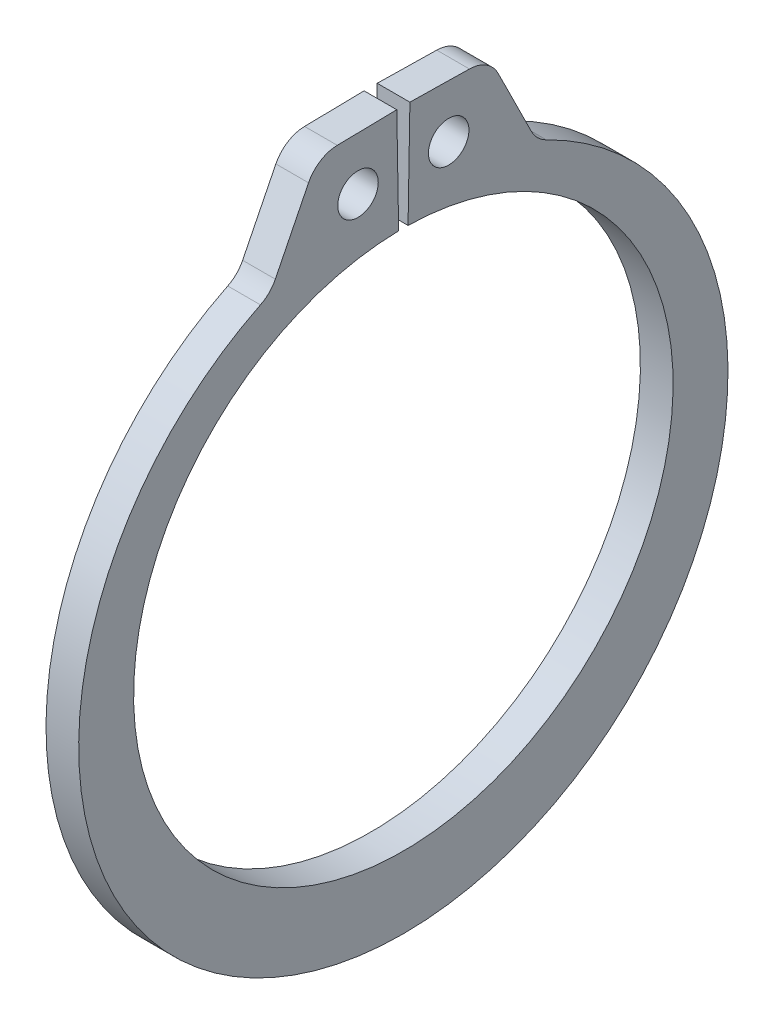
ISO-10303-21;
HEADER;
FILE_DESCRIPTION(('STEP AP214'),'2;1');
FILE_NAME('part.step','',(''),(''),'','','');
FILE_SCHEMA(('AUTOMOTIVE_DESIGN { 1 0 10303 214 1 1 1 1 }'));
ENDSEC;
DATA;
#1=APPLICATION_CONTEXT('core data for automotive mechanical design processes');
#2=APPLICATION_PROTOCOL_DEFINITION('international standard','automotive_design',2000,#1);
#3=PRODUCT_CONTEXT('',#1,'mechanical');
#4=PRODUCT('Part','Part','',(#3));
#5=PRODUCT_RELATED_PRODUCT_CATEGORY('part','',(#4));
#6=PRODUCT_DEFINITION_FORMATION('','',#4);
#7=PRODUCT_DEFINITION_CONTEXT('part definition',#1,'design');
#8=PRODUCT_DEFINITION('design','',#6,#7);
#9=PRODUCT_DEFINITION_SHAPE('','',#8);
#10=(LENGTH_UNIT() NAMED_UNIT(*) SI_UNIT(.MILLI.,.METRE.));
#11=(NAMED_UNIT(*) PLANE_ANGLE_UNIT() SI_UNIT($,.RADIAN.));
#12=(NAMED_UNIT(*) SI_UNIT($,.STERADIAN.) SOLID_ANGLE_UNIT());
#13=UNCERTAINTY_MEASURE_WITH_UNIT(LENGTH_MEASURE(1.E-05),#10,'distance_accuracy_value','');
#14=(GEOMETRIC_REPRESENTATION_CONTEXT(3) GLOBAL_UNCERTAINTY_ASSIGNED_CONTEXT((#13)) GLOBAL_UNIT_ASSIGNED_CONTEXT((#10,
#11,#12)) REPRESENTATION_CONTEXT('',''));
#15=CARTESIAN_POINT('',(0.,0.,0.));
#16=DIRECTION('',(0.,0.,1.));
#17=DIRECTION('',(1.,0.,0.));
#18=AXIS2_PLACEMENT_3D('',#15,#16,#17);
#19=CARTESIAN_POINT('',(0.5334,0.,0.));
#20=DIRECTION('',(1.,0.,0.));
#21=DIRECTION('',(0.,0.,-1.));
#22=AXIS2_PLACEMENT_3D('',#19,#20,#21);
#23=PLANE('',#22);
#24=CARTESIAN_POINT('',(0.5334,10.5040886416162,1.47894687499924));
#25=DIRECTION('',(1.,0.,0.));
#26=DIRECTION('',(0.,0.,-1.));
#27=AXIS2_PLACEMENT_3D('',#24,#25,#26);
#28=CIRCLE('',#27,0.6604);
#29=CARTESIAN_POINT('',(0.5334,10.5040886416162,0.818546874999242));
#30=VERTEX_POINT('',#29);
#31=EDGE_CURVE('E221',#30,#30,#28,.T.);
#32=ORIENTED_EDGE('',*,*,#31,.F.);
#33=EDGE_LOOP('',(#32));
#34=FACE_BOUND('',#33,.T.);
#35=DIRECTION('',(0.,-0.0174524064372834,0.999847695156391));
#36=VECTOR('',#35,1.);
#37=CARTESIAN_POINT('',(0.5334,12.2536334279892,0.213887967092129));
#38=LINE('',#37,#36);
#39=CARTESIAN_POINT('',(0.5334,12.2536334279892,0.213887967092129));
#40=VERTEX_POINT('',#39);
#41=CARTESIAN_POINT('',(0.5334,12.2197304327649,2.15618926265799));
#42=VERTEX_POINT('',#41);
#43=EDGE_CURVE('E133',#40,#42,#38,.T.);
#44=ORIENTED_EDGE('',*,*,#43,.T.);
#45=CARTESIAN_POINT('',(0.5334,11.1530929115721,2.13757103547069));
#46=DIRECTION('',(1.,0.,0.));
#47=DIRECTION('',(0.,0.,-1.));
#48=AXIS2_PLACEMENT_3D('',#45,#46,#47);
#49=CIRCLE('',#48,1.0668);
#50=CARTESIAN_POINT('',(0.5334,11.6279813258754,3.09284232361897));
#51=VERTEX_POINT('',#50);
#52=EDGE_CURVE('E174',#42,#51,#49,.T.);
#53=ORIENTED_EDGE('',*,*,#52,.T.);
#54=DIRECTION('',(0.,-0.895454900776411,0.445152244378829));
#55=VECTOR('',#54,1.);
#56=CARTESIAN_POINT('',(0.5334,12.2084177333914,2.80429337570331));
#57=LINE('',#56,#55);
#58=CARTESIAN_POINT('',(0.5334,9.44768608117989,4.1767197145888));
#59=VERTEX_POINT('',#58);
#60=EDGE_CURVE('E213',#51,#59,#57,.T.);
#61=ORIENTED_EDGE('',*,*,#60,.T.);
#62=CARTESIAN_POINT('',(0.5334,9.92257449548323,5.13199100273708));
#63=DIRECTION('',(1.,0.,0.));
#64=DIRECTION('',(0.,0.,-1.));
#65=AXIS2_PLACEMENT_3D('',#62,#63,#64);
#66=CIRCLE('',#65,1.0668);
#67=CARTESIAN_POINT('',(0.5334,8.96468609124395,4.66240390216475));
#68=VERTEX_POINT('',#67);
#69=EDGE_CURVE('E181',#59,#68,#66,.F.);
#70=ORIENTED_EDGE('',*,*,#69,.T.);
#71=CARTESIAN_POINT('',(0.5334,-0.545929997486656,0.));
#72=DIRECTION('',(1.,0.,0.));
#73=DIRECTION('',(0.,0.,-1.));
#74=AXIS2_PLACEMENT_3D('',#71,#72,#73);
#75=CIRCLE('',#74,10.5919700025133);
#76=CARTESIAN_POINT('',(0.5334,8.96468609124395,-4.66240390216475));
#77=VERTEX_POINT('',#76);
#78=EDGE_CURVE('E206',#68,#77,#75,.T.);
#79=ORIENTED_EDGE('',*,*,#78,.T.);
#80=CARTESIAN_POINT('',(0.5334,9.92257449548323,-5.13199100273708));
#81=DIRECTION('',(1.,0.,0.));
#82=DIRECTION('',(0.,0.,-1.));
#83=AXIS2_PLACEMENT_3D('',#80,#81,#82);
#84=CIRCLE('',#83,1.0668);
#85=CARTESIAN_POINT('',(0.5334,9.44768608117989,-4.1767197145888));
#86=VERTEX_POINT('',#85);
#87=EDGE_CURVE('E11',#77,#86,#84,.F.);
#88=ORIENTED_EDGE('',*,*,#87,.T.);
#89=DIRECTION('',(0.,0.895454900776411,0.445152244378829));
#90=VECTOR('',#89,1.);
#91=CARTESIAN_POINT('',(0.5334,12.2084177333914,-2.80429337570331));
#92=LINE('',#91,#90);
#93=CARTESIAN_POINT('',(0.5334,11.6279813258754,-3.09284232361897));
#94=VERTEX_POINT('',#93);
#95=EDGE_CURVE('E205',#86,#94,#92,.T.);
#96=ORIENTED_EDGE('',*,*,#95,.T.);
#97=CARTESIAN_POINT('',(0.5334,11.1530929115721,-2.13757103547069));
#98=DIRECTION('',(1.,0.,0.));
#99=DIRECTION('',(0.,0.,-1.));
#100=AXIS2_PLACEMENT_3D('',#97,#98,#99);
#101=CIRCLE('',#100,1.0668);
#102=CARTESIAN_POINT('',(0.5334,12.2197304327649,-2.15618926265799));
#103=VERTEX_POINT('',#102);
#104=EDGE_CURVE('E49',#94,#103,#101,.T.);
#105=ORIENTED_EDGE('',*,*,#104,.T.);
#106=DIRECTION('',(0.,0.0174524064372834,0.999847695156391));
#107=VECTOR('',#106,1.);
#108=CARTESIAN_POINT('',(0.5334,12.2536334279892,-0.213887967092129));
#109=LINE('',#108,#107);
#110=CARTESIAN_POINT('',(0.5334,12.2536334279892,-0.213887967092129));
#111=VERTEX_POINT('',#110);
#112=EDGE_CURVE('E210',#103,#111,#109,.T.);
#113=ORIENTED_EDGE('',*,*,#112,.T.);
#114=DIRECTION('',(0.,-0.999847695156391,0.0174524064372836));
#115=VECTOR('',#114,1.);
#116=CARTESIAN_POINT('',(0.5334,8.79975954984091,-0.153600374295177));
#117=LINE('',#116,#115);
#118=CARTESIAN_POINT('',(0.5334,8.79975954984091,-0.153600374295177));
#119=VERTEX_POINT('',#118);
#120=EDGE_CURVE('E139',#111,#119,#117,.T.);
#121=ORIENTED_EDGE('',*,*,#120,.T.);
#122=CARTESIAN_POINT('',(0.5334,0.,0.));
#123=DIRECTION('',(-1.,0.,0.));
#124=DIRECTION('',(0.,0.,-1.));
#125=AXIS2_PLACEMENT_3D('',#122,#123,#124);
#126=CIRCLE('',#125,8.8011);
#127=CARTESIAN_POINT('',(0.5334,8.79975954984091,0.153600374295177));
#128=VERTEX_POINT('',#127);
#129=EDGE_CURVE('E134',#119,#128,#126,.T.);
#130=ORIENTED_EDGE('',*,*,#129,.T.);
#131=DIRECTION('',(0.,0.999847695156391,0.0174524064372836));
#132=VECTOR('',#131,1.);
#133=CARTESIAN_POINT('',(0.5334,8.79975954984091,0.153600374295177));
#134=LINE('',#133,#132);
#135=EDGE_CURVE('E125',#128,#40,#134,.T.);
#136=ORIENTED_EDGE('',*,*,#135,.T.);
#137=EDGE_LOOP('',(#44,#53,#61,#70,#79,#88,#96,#105,#113,#121,#130,#136));
#138=FACE_BOUND('',#137,.T.);
#139=CARTESIAN_POINT('',(0.5334,10.5040886416162,-1.47894687499924));
#140=DIRECTION('',(1.,0.,0.));
#141=DIRECTION('',(0.,0.,-1.));
#142=AXIS2_PLACEMENT_3D('',#139,#140,#141);
#143=CIRCLE('',#142,0.6604);
#144=CARTESIAN_POINT('',(0.5334,10.5040886416162,-2.13934687499924));
#145=VERTEX_POINT('',#144);
#146=EDGE_CURVE('E247',#145,#145,#143,.T.);
#147=ORIENTED_EDGE('',*,*,#146,.F.);
#148=EDGE_LOOP('',(#147));
#149=FACE_BOUND('',#148,.T.);
#150=ADVANCED_FACE('F34',(#34,#138,#149),#23,.T.);
#151=CARTESIAN_POINT('',(-0.5334,0.,0.));
#152=DIRECTION('',(1.,0.,0.));
#153=DIRECTION('',(0.,0.,-1.));
#154=AXIS2_PLACEMENT_3D('',#151,#152,#153);
#155=PLANE('',#154);
#156=CARTESIAN_POINT('',(-0.5334,10.5040886416162,1.47894687499924));
#157=DIRECTION('',(1.,0.,0.));
#158=DIRECTION('',(0.,0.,-1.));
#159=AXIS2_PLACEMENT_3D('',#156,#157,#158);
#160=CIRCLE('',#159,0.6604);
#161=CARTESIAN_POINT('',(-0.5334,10.5040886416162,0.818546874999242));
#162=VERTEX_POINT('',#161);
#163=EDGE_CURVE('E244',#162,#162,#160,.T.);
#164=ORIENTED_EDGE('',*,*,#163,.T.);
#165=EDGE_LOOP('',(#164));
#166=FACE_BOUND('',#165,.T.);
#167=DIRECTION('',(0.,-0.895454900776411,0.445152244378829));
#168=VECTOR('',#167,1.);
#169=CARTESIAN_POINT('',(-0.5334,12.2084177333914,2.80429337570331));
#170=LINE('',#169,#168);
#171=CARTESIAN_POINT('',(-0.5334,11.6279813258754,3.09284232361897));
#172=VERTEX_POINT('',#171);
#173=CARTESIAN_POINT('',(-0.5334,9.44768608117989,4.1767197145888));
#174=VERTEX_POINT('',#173);
#175=EDGE_CURVE('E200',#172,#174,#170,.T.);
#176=ORIENTED_EDGE('',*,*,#175,.F.);
#177=CARTESIAN_POINT('',(-0.5334,11.1530929115721,2.13757103547069));
#178=DIRECTION('',(1.,0.,0.));
#179=DIRECTION('',(0.,0.,-1.));
#180=AXIS2_PLACEMENT_3D('',#177,#178,#179);
#181=CIRCLE('',#180,1.0668);
#182=CARTESIAN_POINT('',(-0.5334,12.2197304327649,2.15618926265799));
#183=VERTEX_POINT('',#182);
#184=EDGE_CURVE('E170',#172,#183,#181,.F.);
#185=ORIENTED_EDGE('',*,*,#184,.T.);
#186=DIRECTION('',(0.,-0.0174524064372834,0.999847695156391));
#187=VECTOR('',#186,1.);
#188=CARTESIAN_POINT('',(-0.5334,12.2536334279892,0.213887967092129));
#189=LINE('',#188,#187);
#190=CARTESIAN_POINT('',(-0.5334,12.2536334279892,0.213887967092129));
#191=VERTEX_POINT('',#190);
#192=EDGE_CURVE('E223',#191,#183,#189,.T.);
#193=ORIENTED_EDGE('',*,*,#192,.F.);
#194=DIRECTION('',(0.,0.999847695156391,0.0174524064372836));
#195=VECTOR('',#194,1.);
#196=CARTESIAN_POINT('',(-0.5334,8.79975954984091,0.153600374295177));
#197=LINE('',#196,#195);
#198=CARTESIAN_POINT('',(-0.5334,8.79975954984091,0.153600374295177));
#199=VERTEX_POINT('',#198);
#200=EDGE_CURVE('E220',#199,#191,#197,.T.);
#201=ORIENTED_EDGE('',*,*,#200,.F.);
#202=CARTESIAN_POINT('',(-0.5334,0.,0.));
#203=DIRECTION('',(-1.,0.,0.));
#204=DIRECTION('',(0.,0.,-1.));
#205=AXIS2_PLACEMENT_3D('',#202,#203,#204);
#206=CIRCLE('',#205,8.8011);
#207=CARTESIAN_POINT('',(-0.5334,8.79975954984091,-0.153600374295177));
#208=VERTEX_POINT('',#207);
#209=EDGE_CURVE('E147',#208,#199,#206,.T.);
#210=ORIENTED_EDGE('',*,*,#209,.F.);
#211=DIRECTION('',(0.,-0.999847695156391,0.0174524064372836));
#212=VECTOR('',#211,1.);
#213=CARTESIAN_POINT('',(-0.5334,8.79975954984091,-0.153600374295177));
#214=LINE('',#213,#212);
#215=CARTESIAN_POINT('',(-0.5334,12.2536334279892,-0.213887967092129));
#216=VERTEX_POINT('',#215);
#217=EDGE_CURVE('E143',#216,#208,#214,.T.);
#218=ORIENTED_EDGE('',*,*,#217,.F.);
#219=DIRECTION('',(0.,0.0174524064372834,0.999847695156391));
#220=VECTOR('',#219,1.);
#221=CARTESIAN_POINT('',(-0.5334,12.2536334279892,-0.213887967092129));
#222=LINE('',#221,#220);
#223=CARTESIAN_POINT('',(-0.5334,12.2197304327649,-2.15618926265799));
#224=VERTEX_POINT('',#223);
#225=EDGE_CURVE('E228',#224,#216,#222,.T.);
#226=ORIENTED_EDGE('',*,*,#225,.F.);
#227=CARTESIAN_POINT('',(-0.5334,11.1530929115721,-2.13757103547069));
#228=DIRECTION('',(1.,0.,0.));
#229=DIRECTION('',(0.,0.,-1.));
#230=AXIS2_PLACEMENT_3D('',#227,#228,#229);
#231=CIRCLE('',#230,1.0668);
#232=CARTESIAN_POINT('',(-0.5334,11.6279813258754,-3.09284232361897));
#233=VERTEX_POINT('',#232);
#234=EDGE_CURVE('E168',#224,#233,#231,.F.);
#235=ORIENTED_EDGE('',*,*,#234,.T.);
#236=DIRECTION('',(0.,0.895454900776411,0.445152244378829));
#237=VECTOR('',#236,1.);
#238=CARTESIAN_POINT('',(-0.5334,12.2084177333914,-2.80429337570331));
#239=LINE('',#238,#237);
#240=CARTESIAN_POINT('',(-0.5334,9.44768608117989,-4.1767197145888));
#241=VERTEX_POINT('',#240);
#242=EDGE_CURVE('E191',#241,#233,#239,.T.);
#243=ORIENTED_EDGE('',*,*,#242,.F.);
#244=CARTESIAN_POINT('',(-0.5334,9.92257449548323,-5.13199100273708));
#245=DIRECTION('',(1.,0.,0.));
#246=DIRECTION('',(0.,0.,-1.));
#247=AXIS2_PLACEMENT_3D('',#244,#245,#246);
#248=CIRCLE('',#247,1.0668);
#249=CARTESIAN_POINT('',(-0.5334,8.96468609124395,-4.66240390216475));
#250=VERTEX_POINT('',#249);
#251=EDGE_CURVE('E42',#241,#250,#248,.T.);
#252=ORIENTED_EDGE('',*,*,#251,.T.);
#253=CARTESIAN_POINT('',(-0.5334,-0.545929997486656,0.));
#254=DIRECTION('',(1.,0.,0.));
#255=DIRECTION('',(0.,0.,-1.));
#256=AXIS2_PLACEMENT_3D('',#253,#254,#255);
#257=CIRCLE('',#256,10.5919700025133);
#258=CARTESIAN_POINT('',(-0.5334,8.96468609124395,4.66240390216475));
#259=VERTEX_POINT('',#258);
#260=EDGE_CURVE('E189',#259,#250,#257,.T.);
#261=ORIENTED_EDGE('',*,*,#260,.F.);
#262=CARTESIAN_POINT('',(-0.5334,9.92257449548323,5.13199100273708));
#263=DIRECTION('',(1.,0.,0.));
#264=DIRECTION('',(0.,0.,-1.));
#265=AXIS2_PLACEMENT_3D('',#262,#263,#264);
#266=CIRCLE('',#265,1.0668);
#267=EDGE_CURVE('E179',#259,#174,#266,.T.);
#268=ORIENTED_EDGE('',*,*,#267,.T.);
#269=EDGE_LOOP('',(#176,#185,#193,#201,#210,#218,#226,#235,#243,#252,#261,#268));
#270=FACE_BOUND('',#269,.T.);
#271=CARTESIAN_POINT('',(-0.5334,10.5040886416162,-1.47894687499924));
#272=DIRECTION('',(1.,0.,0.));
#273=DIRECTION('',(0.,0.,-1.));
#274=AXIS2_PLACEMENT_3D('',#271,#272,#273);
#275=CIRCLE('',#274,0.6604);
#276=CARTESIAN_POINT('',(-0.5334,10.5040886416162,-2.13934687499924));
#277=VERTEX_POINT('',#276);
#278=EDGE_CURVE('E250',#277,#277,#275,.T.);
#279=ORIENTED_EDGE('',*,*,#278,.T.);
#280=EDGE_LOOP('',(#279));
#281=FACE_BOUND('',#280,.T.);
#282=ADVANCED_FACE('F187',(#166,#270,#281),#155,.F.);
#283=CARTESIAN_POINT('',(0.5334,0.,0.));
#284=DIRECTION('',(-1.,0.,0.));
#285=DIRECTION('',(0.,0.,1.));
#286=AXIS2_PLACEMENT_3D('',#283,#284,#285);
#287=CYLINDRICAL_SURFACE('',#286,8.8011);
#288=ORIENTED_EDGE('',*,*,#209,.T.);
#289=DIRECTION('',(-1.,0.,0.));
#290=VECTOR('',#289,1.);
#291=CARTESIAN_POINT('',(0.5334,8.79975954984091,0.153600374295177));
#292=LINE('',#291,#290);
#293=EDGE_CURVE('E129',#128,#199,#292,.T.);
#294=ORIENTED_EDGE('',*,*,#293,.F.);
#295=ORIENTED_EDGE('',*,*,#129,.F.);
#296=DIRECTION('',(-1.,0.,0.));
#297=VECTOR('',#296,1.);
#298=CARTESIAN_POINT('',(0.5334,8.79975954984091,-0.153600374295177));
#299=LINE('',#298,#297);
#300=EDGE_CURVE('E218',#119,#208,#299,.T.);
#301=ORIENTED_EDGE('',*,*,#300,.T.);
#302=EDGE_LOOP('',(#288,#294,#295,#301));
#303=FACE_BOUND('',#302,.T.);
#304=ADVANCED_FACE('F145',(#303),#287,.F.);
#305=CARTESIAN_POINT('',(0.5334,8.79975954984091,0.153600374295177));
#306=DIRECTION('',(0.,-0.0174524064372836,0.999847695156391));
#307=DIRECTION('',(0.,-0.999847695156391,-0.0174524064372836));
#308=AXIS2_PLACEMENT_3D('',#305,#306,#307);
#309=PLANE('',#308);
#310=ORIENTED_EDGE('',*,*,#200,.T.);
#311=DIRECTION('',(-1.,0.,0.));
#312=VECTOR('',#311,1.);
#313=CARTESIAN_POINT('',(0.5334,12.2536334279892,0.213887967092129));
#314=LINE('',#313,#312);
#315=EDGE_CURVE('E132',#40,#191,#314,.T.);
#316=ORIENTED_EDGE('',*,*,#315,.F.);
#317=ORIENTED_EDGE('',*,*,#135,.F.);
#318=ORIENTED_EDGE('',*,*,#293,.T.);
#319=EDGE_LOOP('',(#310,#316,#317,#318));
#320=FACE_BOUND('',#319,.T.);
#321=ADVANCED_FACE('F127',(#320),#309,.F.);
#322=CARTESIAN_POINT('',(0.5334,12.2536334279892,0.213887967092129));
#323=DIRECTION('',(0.,-0.999847695156391,-0.0174524064372834));
#324=DIRECTION('',(0.,0.0174524064372834,-0.999847695156391));
#325=AXIS2_PLACEMENT_3D('',#322,#323,#324);
#326=PLANE('',#325);
#327=ORIENTED_EDGE('',*,*,#192,.T.);
#328=DIRECTION('',(-1.,0.,0.));
#329=VECTOR('',#328,1.);
#330=CARTESIAN_POINT('',(0.5334,12.2197304327649,2.15618926265799));
#331=LINE('',#330,#329);
#332=EDGE_CURVE('E57',#183,#42,#331,.F.);
#333=ORIENTED_EDGE('',*,*,#332,.T.);
#334=ORIENTED_EDGE('',*,*,#43,.F.);
#335=ORIENTED_EDGE('',*,*,#315,.T.);
#336=EDGE_LOOP('',(#327,#333,#334,#335));
#337=FACE_BOUND('',#336,.T.);
#338=ADVANCED_FACE('F239',(#337),#326,.F.);
#339=CARTESIAN_POINT('',(0.5334,12.2084177333914,2.80429337570331));
#340=DIRECTION('',(0.,-0.445152244378829,-0.895454900776411));
#341=DIRECTION('',(0.,0.895454900776411,-0.445152244378829));
#342=AXIS2_PLACEMENT_3D('',#339,#340,#341);
#343=PLANE('',#342);
#344=ORIENTED_EDGE('',*,*,#175,.T.);
#345=DIRECTION('',(1.,0.,0.));
#346=VECTOR('',#345,1.);
#347=CARTESIAN_POINT('',(0.5334,9.44768608117989,4.1767197145888));
#348=LINE('',#347,#346);
#349=EDGE_CURVE('E161',#174,#59,#348,.T.);
#350=ORIENTED_EDGE('',*,*,#349,.T.);
#351=ORIENTED_EDGE('',*,*,#60,.F.);
#352=DIRECTION('',(-1.,0.,0.));
#353=VECTOR('',#352,1.);
#354=CARTESIAN_POINT('',(0.5334,11.6279813258754,3.09284232361897));
#355=LINE('',#354,#353);
#356=EDGE_CURVE('E158',#51,#172,#355,.T.);
#357=ORIENTED_EDGE('',*,*,#356,.T.);
#358=EDGE_LOOP('',(#344,#350,#351,#357));
#359=FACE_BOUND('',#358,.T.);
#360=ADVANCED_FACE('F280',(#359),#343,.F.);
#361=CARTESIAN_POINT('',(0.5334,-0.545929997486656,0.));
#362=DIRECTION('',(-1.,0.,0.));
#363=DIRECTION('',(0.,0.,1.));
#364=AXIS2_PLACEMENT_3D('',#361,#362,#363);
#365=CYLINDRICAL_SURFACE('',#364,10.5919700025133);
#366=ORIENTED_EDGE('',*,*,#78,.F.);
#367=DIRECTION('',(-1.,0.,0.));
#368=VECTOR('',#367,1.);
#369=CARTESIAN_POINT('',(0.5334,8.96468609124395,4.66240390216475));
#370=LINE('',#369,#368);
#371=EDGE_CURVE('E150',#68,#259,#370,.T.);
#372=ORIENTED_EDGE('',*,*,#371,.T.);
#373=ORIENTED_EDGE('',*,*,#260,.T.);
#374=DIRECTION('',(-1.,0.,0.));
#375=VECTOR('',#374,1.);
#376=CARTESIAN_POINT('',(0.5334,8.96468609124395,-4.66240390216475));
#377=LINE('',#376,#375);
#378=EDGE_CURVE('E148',#250,#77,#377,.F.);
#379=ORIENTED_EDGE('',*,*,#378,.T.);
#380=EDGE_LOOP('',(#366,#372,#373,#379));
#381=FACE_BOUND('',#380,.T.);
#382=ADVANCED_FACE('F197',(#381),#365,.T.);
#383=CARTESIAN_POINT('',(0.5334,12.2084177333914,-2.80429337570331));
#384=DIRECTION('',(0.,-0.445152244378829,0.895454900776411));
#385=DIRECTION('',(0.,-0.895454900776411,-0.445152244378829));
#386=AXIS2_PLACEMENT_3D('',#383,#384,#385);
#387=PLANE('',#386);
#388=ORIENTED_EDGE('',*,*,#95,.F.);
#389=DIRECTION('',(1.,0.,0.));
#390=VECTOR('',#389,1.);
#391=CARTESIAN_POINT('',(-0.5334,9.44768608117989,-4.1767197145888));
#392=LINE('',#391,#390);
#393=EDGE_CURVE('E165',#86,#241,#392,.F.);
#394=ORIENTED_EDGE('',*,*,#393,.T.);
#395=ORIENTED_EDGE('',*,*,#242,.T.);
#396=DIRECTION('',(-1.,0.,0.));
#397=VECTOR('',#396,1.);
#398=CARTESIAN_POINT('',(0.5334,11.6279813258754,-3.09284232361897));
#399=LINE('',#398,#397);
#400=EDGE_CURVE('E163',#233,#94,#399,.F.);
#401=ORIENTED_EDGE('',*,*,#400,.T.);
#402=EDGE_LOOP('',(#388,#394,#395,#401));
#403=FACE_BOUND('',#402,.T.);
#404=ADVANCED_FACE('F208',(#403),#387,.F.);
#405=CARTESIAN_POINT('',(0.5334,12.2536334279892,-0.213887967092129));
#406=DIRECTION('',(0.,-0.999847695156391,0.0174524064372834));
#407=DIRECTION('',(0.,-0.0174524064372834,-0.999847695156391));
#408=AXIS2_PLACEMENT_3D('',#405,#406,#407);
#409=PLANE('',#408);
#410=ORIENTED_EDGE('',*,*,#112,.F.);
#411=DIRECTION('',(-1.,0.,0.));
#412=VECTOR('',#411,1.);
#413=CARTESIAN_POINT('',(0.5334,12.2197304327649,-2.15618926265799));
#414=LINE('',#413,#412);
#415=EDGE_CURVE('E176',#103,#224,#414,.T.);
#416=ORIENTED_EDGE('',*,*,#415,.T.);
#417=ORIENTED_EDGE('',*,*,#225,.T.);
#418=DIRECTION('',(-1.,0.,0.));
#419=VECTOR('',#418,1.);
#420=CARTESIAN_POINT('',(0.5334,12.2536334279892,-0.213887967092129));
#421=LINE('',#420,#419);
#422=EDGE_CURVE('E152',#111,#216,#421,.T.);
#423=ORIENTED_EDGE('',*,*,#422,.F.);
#424=EDGE_LOOP('',(#410,#416,#417,#423));
#425=FACE_BOUND('',#424,.T.);
#426=ADVANCED_FACE('F273',(#425),#409,.F.);
#427=CARTESIAN_POINT('',(0.5334,8.79975954984091,-0.153600374295177));
#428=DIRECTION('',(0.,-0.0174524064372836,-0.999847695156391));
#429=DIRECTION('',(0.,0.999847695156391,-0.0174524064372836));
#430=AXIS2_PLACEMENT_3D('',#427,#428,#429);
#431=PLANE('',#430);
#432=ORIENTED_EDGE('',*,*,#217,.T.);
#433=ORIENTED_EDGE('',*,*,#300,.F.);
#434=ORIENTED_EDGE('',*,*,#120,.F.);
#435=ORIENTED_EDGE('',*,*,#422,.T.);
#436=EDGE_LOOP('',(#432,#433,#434,#435));
#437=FACE_BOUND('',#436,.T.);
#438=ADVANCED_FACE('F235',(#437),#431,.F.);
#439=CARTESIAN_POINT('',(0.5334,10.5040886416162,1.47894687499924));
#440=DIRECTION('',(-1.,0.,0.));
#441=DIRECTION('',(0.,0.,1.));
#442=AXIS2_PLACEMENT_3D('',#439,#440,#441);
#443=CYLINDRICAL_SURFACE('',#442,0.6604);
#444=ORIENTED_EDGE('',*,*,#31,.T.);
#445=EDGE_LOOP('',(#444));
#446=FACE_BOUND('',#445,.T.);
#447=ORIENTED_EDGE('',*,*,#163,.F.);
#448=EDGE_LOOP('',(#447));
#449=FACE_BOUND('',#448,.T.);
#450=ADVANCED_FACE('F268',(#446,#449),#443,.F.);
#451=CARTESIAN_POINT('',(0.5334,10.5040886416162,-1.47894687499924));
#452=DIRECTION('',(-1.,0.,0.));
#453=DIRECTION('',(0.,0.,1.));
#454=AXIS2_PLACEMENT_3D('',#451,#452,#453);
#455=CYLINDRICAL_SURFACE('',#454,0.6604);
#456=ORIENTED_EDGE('',*,*,#146,.T.);
#457=EDGE_LOOP('',(#456));
#458=FACE_BOUND('',#457,.T.);
#459=ORIENTED_EDGE('',*,*,#278,.F.);
#460=EDGE_LOOP('',(#459));
#461=FACE_BOUND('',#460,.T.);
#462=ADVANCED_FACE('F256',(#458,#461),#455,.F.);
#463=CARTESIAN_POINT('',(0.5334,9.92257449548323,5.13199100273708));
#464=DIRECTION('',(-1.,0.,0.));
#465=DIRECTION('',(0.,0.,1.));
#466=AXIS2_PLACEMENT_3D('',#463,#464,#465);
#467=CYLINDRICAL_SURFACE('',#466,1.0668);
#468=ORIENTED_EDGE('',*,*,#69,.F.);
#469=ORIENTED_EDGE('',*,*,#349,.F.);
#470=ORIENTED_EDGE('',*,*,#267,.F.);
#471=ORIENTED_EDGE('',*,*,#371,.F.);
#472=EDGE_LOOP('',(#468,#469,#470,#471));
#473=FACE_BOUND('',#472,.T.);
#474=ADVANCED_FACE('F290',(#473),#467,.F.);
#475=CARTESIAN_POINT('',(0.5334,9.92257449548323,-5.13199100273708));
#476=DIRECTION('',(-1.,0.,0.));
#477=DIRECTION('',(0.,0.,1.));
#478=AXIS2_PLACEMENT_3D('',#475,#476,#477);
#479=CYLINDRICAL_SURFACE('',#478,1.0668);
#480=ORIENTED_EDGE('',*,*,#87,.F.);
#481=ORIENTED_EDGE('',*,*,#378,.F.);
#482=ORIENTED_EDGE('',*,*,#251,.F.);
#483=ORIENTED_EDGE('',*,*,#393,.F.);
#484=EDGE_LOOP('',(#480,#481,#482,#483));
#485=FACE_BOUND('',#484,.T.);
#486=ADVANCED_FACE('F203',(#485),#479,.F.);
#487=CARTESIAN_POINT('',(0.5334,11.1530929115721,2.13757103547069));
#488=DIRECTION('',(-1.,0.,0.));
#489=DIRECTION('',(0.,0.,1.));
#490=AXIS2_PLACEMENT_3D('',#487,#488,#489);
#491=CYLINDRICAL_SURFACE('',#490,1.0668);
#492=ORIENTED_EDGE('',*,*,#52,.F.);
#493=ORIENTED_EDGE('',*,*,#332,.F.);
#494=ORIENTED_EDGE('',*,*,#184,.F.);
#495=ORIENTED_EDGE('',*,*,#356,.F.);
#496=EDGE_LOOP('',(#492,#493,#494,#495));
#497=FACE_BOUND('',#496,.T.);
#498=ADVANCED_FACE('F295',(#497),#491,.T.);
#499=CARTESIAN_POINT('',(0.5334,11.1530929115721,-2.13757103547069));
#500=DIRECTION('',(-1.,0.,0.));
#501=DIRECTION('',(0.,0.,1.));
#502=AXIS2_PLACEMENT_3D('',#499,#500,#501);
#503=CYLINDRICAL_SURFACE('',#502,1.0668);
#504=ORIENTED_EDGE('',*,*,#104,.F.);
#505=ORIENTED_EDGE('',*,*,#400,.F.);
#506=ORIENTED_EDGE('',*,*,#234,.F.);
#507=ORIENTED_EDGE('',*,*,#415,.F.);
#508=EDGE_LOOP('',(#504,#505,#506,#507));
#509=FACE_BOUND('',#508,.T.);
#510=ADVANCED_FACE('F36',(#509),#503,.T.);
#511=CLOSED_SHELL('',(#150,#282,#304,#321,#338,#360,#382,#404,#426,#438,#450,#462,#474,#486,
#498,#510));
#512=MANIFOLD_SOLID_BREP('B2',#511);
#513=ADVANCED_BREP_SHAPE_REPRESENTATION('',(#18,#512),#14);
#514=SHAPE_DEFINITION_REPRESENTATION(#9,#513);
ENDSEC;
END-ISO-10303-21;
